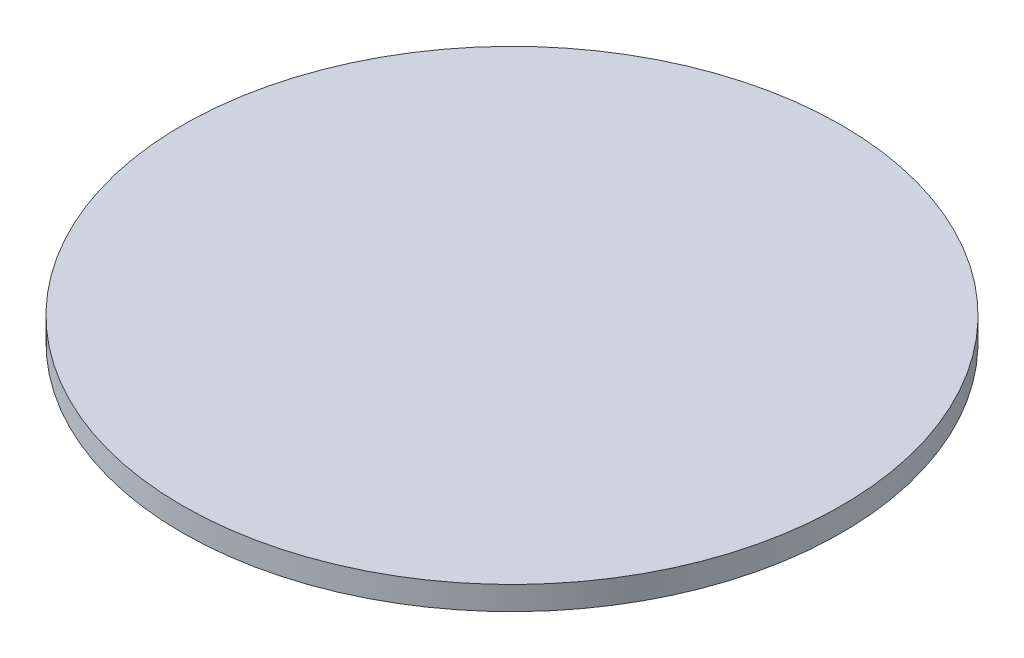
ISO-10303-21;
HEADER;
FILE_DESCRIPTION(('STEP AP214'),'2;1');
FILE_NAME('part.step','',(''),(''),'','','');
FILE_SCHEMA(('AUTOMOTIVE_DESIGN { 1 0 10303 214 1 1 1 1 }'));
ENDSEC;
DATA;
#1=APPLICATION_CONTEXT('core data for automotive mechanical design processes');
#2=APPLICATION_PROTOCOL_DEFINITION('international standard','automotive_design',2000,#1);
#3=PRODUCT_CONTEXT('',#1,'mechanical');
#4=PRODUCT('Part','Part','',(#3));
#5=PRODUCT_RELATED_PRODUCT_CATEGORY('part','',(#4));
#6=PRODUCT_DEFINITION_FORMATION('','',#4);
#7=PRODUCT_DEFINITION_CONTEXT('part definition',#1,'design');
#8=PRODUCT_DEFINITION('design','',#6,#7);
#9=PRODUCT_DEFINITION_SHAPE('','',#8);
#10=(LENGTH_UNIT() NAMED_UNIT(*) SI_UNIT(.MILLI.,.METRE.));
#11=(NAMED_UNIT(*) PLANE_ANGLE_UNIT() SI_UNIT($,.RADIAN.));
#12=(NAMED_UNIT(*) SI_UNIT($,.STERADIAN.) SOLID_ANGLE_UNIT());
#13=UNCERTAINTY_MEASURE_WITH_UNIT(LENGTH_MEASURE(1.E-05),#10,'distance_accuracy_value','');
#14=(GEOMETRIC_REPRESENTATION_CONTEXT(3) GLOBAL_UNCERTAINTY_ASSIGNED_CONTEXT((#13)) GLOBAL_UNIT_ASSIGNED_CONTEXT((#10,
#11,#12)) REPRESENTATION_CONTEXT('',''));
#15=CARTESIAN_POINT('',(0.,0.,0.));
#16=DIRECTION('',(0.,0.,1.));
#17=DIRECTION('',(1.,0.,0.));
#18=AXIS2_PLACEMENT_3D('',#15,#16,#17);
#19=CARTESIAN_POINT('',(0.,6.35,0.));
#20=DIRECTION('',(0.,-1.,0.));
#21=DIRECTION('',(0.,0.,-1.));
#22=AXIS2_PLACEMENT_3D('',#19,#20,#21);
#23=CYLINDRICAL_SURFACE('',#22,88.9);
#24=CARTESIAN_POINT('',(0.,6.35,0.));
#25=DIRECTION('',(0.,1.,0.));
#26=DIRECTION('',(0.,0.,1.));
#27=AXIS2_PLACEMENT_3D('',#24,#25,#26);
#28=CIRCLE('',#27,88.9);
#29=CARTESIAN_POINT('',(0.,6.35,88.9));
#30=VERTEX_POINT('',#29);
#31=EDGE_CURVE('E10',#30,#30,#28,.T.);
#32=ORIENTED_EDGE('',*,*,#31,.F.);
#33=EDGE_LOOP('',(#32));
#34=FACE_BOUND('',#33,.T.);
#35=CARTESIAN_POINT('',(0.,0.,0.));
#36=DIRECTION('',(0.,1.,0.));
#37=DIRECTION('',(0.,0.,1.));
#38=AXIS2_PLACEMENT_3D('',#35,#36,#37);
#39=CIRCLE('',#38,88.9);
#40=CARTESIAN_POINT('',(0.,0.,88.9));
#41=VERTEX_POINT('',#40);
#42=EDGE_CURVE('E34',#41,#41,#39,.T.);
#43=ORIENTED_EDGE('',*,*,#42,.T.);
#44=EDGE_LOOP('',(#43));
#45=FACE_BOUND('',#44,.T.);
#46=ADVANCED_FACE('F31',(#34,#45),#23,.T.);
#47=CARTESIAN_POINT('',(0.,6.35,0.));
#48=DIRECTION('',(0.,1.,0.));
#49=DIRECTION('',(0.,0.,1.));
#50=AXIS2_PLACEMENT_3D('',#47,#48,#49);
#51=PLANE('',#50);
#52=ORIENTED_EDGE('',*,*,#31,.T.);
#53=EDGE_LOOP('',(#52));
#54=FACE_BOUND('',#53,.T.);
#55=ADVANCED_FACE('F46',(#54),#51,.T.);
#56=CARTESIAN_POINT('',(0.,0.,0.));
#57=DIRECTION('',(0.,1.,0.));
#58=DIRECTION('',(0.,0.,1.));
#59=AXIS2_PLACEMENT_3D('',#56,#57,#58);
#60=PLANE('',#59);
#61=ORIENTED_EDGE('',*,*,#42,.F.);
#62=EDGE_LOOP('',(#61));
#63=FACE_BOUND('',#62,.T.);
#64=ADVANCED_FACE('F44',(#63),#60,.F.);
#65=CLOSED_SHELL('',(#46,#55,#64));
#66=MANIFOLD_SOLID_BREP('B2',#65);
#67=ADVANCED_BREP_SHAPE_REPRESENTATION('',(#18,#66),#14);
#68=SHAPE_DEFINITION_REPRESENTATION(#9,#67);
ENDSEC;
END-ISO-10303-21;
